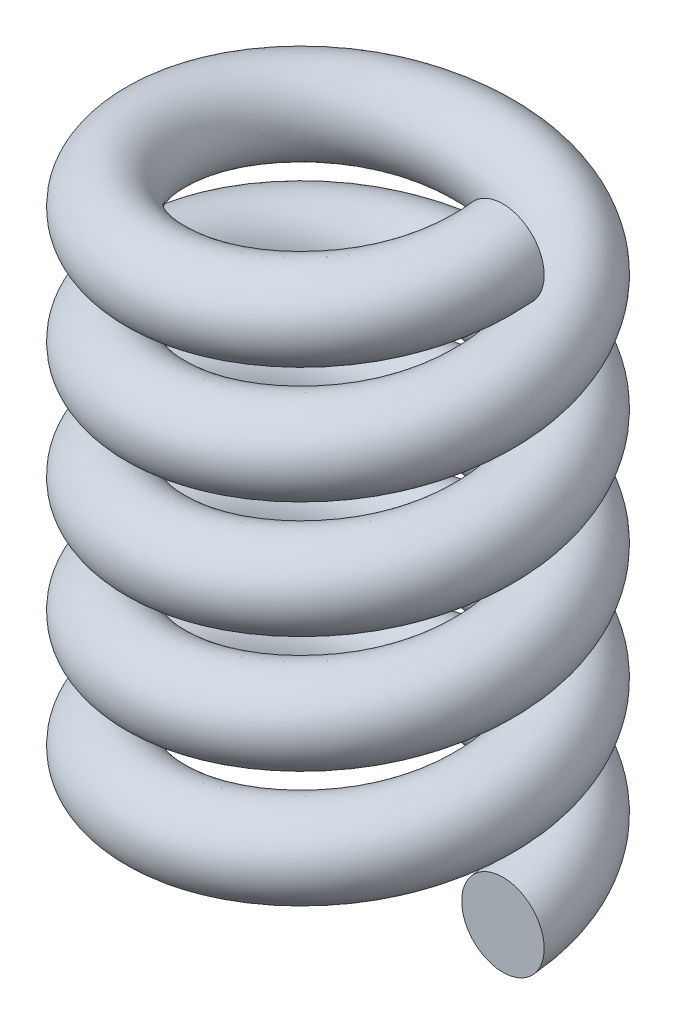
ISO-10303-21;
HEADER;
FILE_DESCRIPTION(('STEP AP214'),'2;1');
FILE_NAME('part.step','',(''),(''),'','','');
FILE_SCHEMA(('AUTOMOTIVE_DESIGN { 1 0 10303 214 1 1 1 1 }'));
ENDSEC;
DATA;
#1=APPLICATION_CONTEXT('core data for automotive mechanical design processes');
#2=APPLICATION_PROTOCOL_DEFINITION('international standard','automotive_design',2000,#1);
#3=PRODUCT_CONTEXT('',#1,'mechanical');
#4=PRODUCT('Part','Part','',(#3));
#5=PRODUCT_RELATED_PRODUCT_CATEGORY('part','',(#4));
#6=PRODUCT_DEFINITION_FORMATION('','',#4);
#7=PRODUCT_DEFINITION_CONTEXT('part definition',#1,'design');
#8=PRODUCT_DEFINITION('design','',#6,#7);
#9=PRODUCT_DEFINITION_SHAPE('','',#8);
#10=(LENGTH_UNIT() NAMED_UNIT(*) SI_UNIT(.MILLI.,.METRE.));
#11=(NAMED_UNIT(*) PLANE_ANGLE_UNIT() SI_UNIT($,.RADIAN.));
#12=(NAMED_UNIT(*) SI_UNIT($,.STERADIAN.) SOLID_ANGLE_UNIT());
#13=UNCERTAINTY_MEASURE_WITH_UNIT(LENGTH_MEASURE(1.E-05),#10,'distance_accuracy_value','');
#14=(GEOMETRIC_REPRESENTATION_CONTEXT(3) GLOBAL_UNCERTAINTY_ASSIGNED_CONTEXT((#13)) GLOBAL_UNIT_ASSIGNED_CONTEXT((#10,
#11,#12)) REPRESENTATION_CONTEXT('',''));
#15=CARTESIAN_POINT('',(0.,0.,0.));
#16=DIRECTION('',(0.,0.,1.));
#17=DIRECTION('',(1.,0.,0.));
#18=AXIS2_PLACEMENT_3D('',#15,#16,#17);
#19=CARTESIAN_POINT('',(20.,5.00122967202342,0.));
#20=DIRECTION('',(0.,0.,1.));
#21=DIRECTION('',(1.,0.,0.));
#22=AXIS2_PLACEMENT_3D('',#19,#20,#21);
#23=PLANE('',#22);
#24=CARTESIAN_POINT('',(20.,5.00122967202342,0.));
#25=DIRECTION('',(0.,0.,1.));
#26=DIRECTION('',(1.,0.,0.));
#27=AXIS2_PLACEMENT_3D('',#24,#25,#26);
#28=CIRCLE('',#27,5.);
#29=CARTESIAN_POINT('',(25.,5.00122967202342,0.));
#30=VERTEX_POINT('',#29);
#31=EDGE_CURVE('E39',#30,#30,#28,.T.);
#32=ORIENTED_EDGE('',*,*,#31,.T.);
#33=EDGE_LOOP('',(#32));
#34=FACE_BOUND('',#33,.T.);
#35=ADVANCED_FACE('F33',(#34),#23,.T.);
#36=CARTESIAN_POINT('',(20.,75.7185901385319,-1.39659253553725E-12));
#37=DIRECTION('',(0.,0.,1.));
#38=DIRECTION('',(1.,0.,0.));
#39=AXIS2_PLACEMENT_3D('',#36,#37,#38);
#40=PLANE('',#39);
#41=CARTESIAN_POINT('',(20.,75.7185901385319,-1.39659253553725E-12));
#42=DIRECTION('',(0.,0.,1.));
#43=DIRECTION('',(1.,0.,0.));
#44=AXIS2_PLACEMENT_3D('',#41,#42,#43);
#45=CIRCLE('',#44,5.);
#46=CARTESIAN_POINT('',(25.,75.7185901385319,-1.74574066942157E-12));
#47=VERTEX_POINT('',#46);
#48=EDGE_CURVE('E10',#47,#47,#45,.T.);
#49=ORIENTED_EDGE('',*,*,#48,.F.);
#50=EDGE_LOOP('',(#49));
#51=FACE_BOUND('',#50,.T.);
#52=ADVANCED_FACE('F48',(#51),#40,.F.);
#53=CARTESIAN_POINT('',(25.,5.00122967202342,0.));
#54=CARTESIAN_POINT('',(25.,5.88519667785478,-10.3553390593274));
#55=CARTESIAN_POINT('',(17.6776695296637,6.76916368368613,-17.6776695296637));
#56=CARTESIAN_POINT('',(10.3553390593274,7.65313068951748,-25.));
#57=CARTESIAN_POINT('',(0.,8.53709769534884,-25.));
#58=CARTESIAN_POINT('',(-10.3553390593274,9.42106470118019,-25.));
#59=CARTESIAN_POINT('',(-17.6776695296637,10.3050317070115,-17.6776695296637));
#60=CARTESIAN_POINT('',(-25.,11.1889987128429,-10.3553390593274));
#61=CARTESIAN_POINT('',(-25.,12.0729657186743,0.));
#62=CARTESIAN_POINT('',(-25.,12.9569327245056,10.3553390593274));
#63=CARTESIAN_POINT('',(-17.6776695296637,13.840899730337,17.6776695296637));
#64=CARTESIAN_POINT('',(-10.3553390593274,14.7248667361683,25.));
#65=CARTESIAN_POINT('',(0.,15.6088337419997,25.));
#66=CARTESIAN_POINT('',(10.3553390593274,16.492800747831,25.));
#67=CARTESIAN_POINT('',(17.6776695296637,17.3767677536624,17.6776695296637));
#68=CARTESIAN_POINT('',(25.,18.2607347594937,10.3553390593274));
#69=CARTESIAN_POINT('',(25.,19.1447017653251,0.));
#70=CARTESIAN_POINT('',(25.,20.0286687711564,-10.3553390593274));
#71=CARTESIAN_POINT('',(17.6776695296637,20.9126357769878,-17.6776695296637));
#72=CARTESIAN_POINT('',(10.3553390593274,21.7966027828191,-25.));
#73=CARTESIAN_POINT('',(0.,22.6805697886505,-25.));
#74=CARTESIAN_POINT('',(-10.3553390593274,23.5645367944818,-25.));
#75=CARTESIAN_POINT('',(-17.6776695296637,24.4485038003132,-17.6776695296637));
#76=CARTESIAN_POINT('',(-25.,25.3324708061446,-10.3553390593274));
#77=CARTESIAN_POINT('',(-25.,26.2164378119759,0.));
#78=CARTESIAN_POINT('',(-25.,27.1004048178073,10.3553390593274));
#79=CARTESIAN_POINT('',(-17.6776695296637,27.9843718236386,17.6776695296637));
#80=CARTESIAN_POINT('',(-10.3553390593274,28.86833882947,25.));
#81=CARTESIAN_POINT('',(0.,29.7523058353013,25.));
#82=CARTESIAN_POINT('',(10.3553390593274,30.6362728411327,25.));
#83=CARTESIAN_POINT('',(17.6776695296637,31.520239846964,17.6776695296637));
#84=CARTESIAN_POINT('',(25.,32.4042068527954,10.3553390593274));
#85=CARTESIAN_POINT('',(25.,33.2881738586267,0.));
#86=CARTESIAN_POINT('',(25.,34.1721408644581,-10.3553390593274));
#87=CARTESIAN_POINT('',(17.6776695296637,35.0561078702894,-17.6776695296637));
#88=CARTESIAN_POINT('',(10.3553390593274,35.9400748761208,-25.));
#89=CARTESIAN_POINT('',(0.,36.8240418819521,-25.));
#90=CARTESIAN_POINT('',(-10.3553390593274,37.7080088877835,-25.));
#91=CARTESIAN_POINT('',(-17.6776695296637,38.5919758936149,-17.6776695296637));
#92=CARTESIAN_POINT('',(-25.,39.4759428994462,-10.3553390593274));
#93=CARTESIAN_POINT('',(-25.,40.3599099052776,0.));
#94=CARTESIAN_POINT('',(-25.,41.2438769111089,10.3553390593274));
#95=CARTESIAN_POINT('',(-17.6776695296637,42.1278439169403,17.6776695296637));
#96=CARTESIAN_POINT('',(-10.3553390593274,43.0118109227716,25.));
#97=CARTESIAN_POINT('',(0.,43.895777928603,25.));
#98=CARTESIAN_POINT('',(10.3553390593274,44.7797449344343,25.));
#99=CARTESIAN_POINT('',(17.6776695296637,45.6637119402657,17.6776695296637));
#100=CARTESIAN_POINT('',(25.,46.547678946097,10.3553390593274));
#101=CARTESIAN_POINT('',(25.,47.4316459519284,0.));
#102=CARTESIAN_POINT('',(25.,48.3156129577597,-10.3553390593274));
#103=CARTESIAN_POINT('',(17.6776695296637,49.1995799635911,-17.6776695296637));
#104=CARTESIAN_POINT('',(10.3553390593274,50.0835469694224,-25.));
#105=CARTESIAN_POINT('',(0.,50.9675139752538,-25.));
#106=CARTESIAN_POINT('',(-10.3553390593274,51.8514809810852,-25.));
#107=CARTESIAN_POINT('',(-17.6776695296637,52.7354479869165,-17.6776695296637));
#108=CARTESIAN_POINT('',(-25.,53.6194149927479,-10.3553390593274));
#109=CARTESIAN_POINT('',(-25.,54.5033819985792,0.));
#110=CARTESIAN_POINT('',(-25.,55.3873490044106,10.3553390593274));
#111=CARTESIAN_POINT('',(-17.6776695296637,56.2713160102419,17.6776695296637));
#112=CARTESIAN_POINT('',(-10.3553390593274,57.1552830160733,25.));
#113=CARTESIAN_POINT('',(0.,58.0392500219046,25.));
#114=CARTESIAN_POINT('',(10.3553390593274,58.923217027736,25.));
#115=CARTESIAN_POINT('',(17.6776695296637,59.8071840335673,17.6776695296637));
#116=CARTESIAN_POINT('',(25.,60.6911510393987,10.3553390593274));
#117=CARTESIAN_POINT('',(25.,61.57511804523,0.));
#118=CARTESIAN_POINT('',(25.,62.4590850510614,-10.3553390593274));
#119=CARTESIAN_POINT('',(17.6776695296637,63.3430520568928,-17.6776695296637));
#120=CARTESIAN_POINT('',(10.3553390593274,64.2270190627241,-25.));
#121=CARTESIAN_POINT('',(0.,65.1109860685555,-25.));
#122=CARTESIAN_POINT('',(-10.3553390593274,65.9949530743868,-25.));
#123=CARTESIAN_POINT('',(-17.6776695296637,66.8789200802182,-17.6776695296637));
#124=CARTESIAN_POINT('',(-25.,67.7628870860495,-10.3553390593274));
#125=CARTESIAN_POINT('',(-25.,68.6468540918809,0.));
#126=CARTESIAN_POINT('',(-25.,69.5308210977122,10.3553390593274));
#127=CARTESIAN_POINT('',(-17.6776695296637,70.4147881035436,17.6776695296637));
#128=CARTESIAN_POINT('',(-10.3553390593274,71.2987551093749,25.));
#129=CARTESIAN_POINT('',(0.,72.1827221152063,25.));
#130=CARTESIAN_POINT('',(10.3553390593274,73.0666891210376,25.));
#131=CARTESIAN_POINT('',(17.6776695296637,73.950656126869,17.6776695296637));
#132=CARTESIAN_POINT('',(25.,74.8346231327004,10.3553390593274));
#133=CARTESIAN_POINT('',(25.,75.7185901385317,0.));
#134=CARTESIAN_POINT('',(25.,15.0012296720234,0.));
#135=CARTESIAN_POINT('',(25.,15.8851966778548,-10.3553390593274));
#136=CARTESIAN_POINT('',(17.6776695296637,16.7691636836861,-17.6776695296637));
#137=CARTESIAN_POINT('',(10.3553390593274,17.6531306895175,-25.));
#138=CARTESIAN_POINT('',(0.,18.5370976953488,-25.));
#139=CARTESIAN_POINT('',(-10.3553390593274,19.4210647011802,-25.));
#140=CARTESIAN_POINT('',(-17.6776695296637,20.3050317070115,-17.6776695296637));
#141=CARTESIAN_POINT('',(-25.,21.1889987128429,-10.3553390593274));
#142=CARTESIAN_POINT('',(-25.,22.0729657186742,0.));
#143=CARTESIAN_POINT('',(-25.,22.9569327245056,10.3553390593274));
#144=CARTESIAN_POINT('',(-17.6776695296637,23.840899730337,17.6776695296637));
#145=CARTESIAN_POINT('',(-10.3553390593274,24.7248667361683,25.));
#146=CARTESIAN_POINT('',(0.,25.6088337419997,25.));
#147=CARTESIAN_POINT('',(10.3553390593274,26.492800747831,25.));
#148=CARTESIAN_POINT('',(17.6776695296637,27.3767677536624,17.6776695296637));
#149=CARTESIAN_POINT('',(25.,28.2607347594937,10.3553390593274));
#150=CARTESIAN_POINT('',(25.,29.1447017653251,0.));
#151=CARTESIAN_POINT('',(25.,30.0286687711564,-10.3553390593274));
#152=CARTESIAN_POINT('',(17.6776695296637,30.9126357769878,-17.6776695296637));
#153=CARTESIAN_POINT('',(10.3553390593274,31.7966027828191,-25.));
#154=CARTESIAN_POINT('',(0.,32.6805697886505,-25.));
#155=CARTESIAN_POINT('',(-10.3553390593274,33.5645367944818,-25.));
#156=CARTESIAN_POINT('',(-17.6776695296637,34.4485038003132,-17.6776695296637));
#157=CARTESIAN_POINT('',(-25.,35.3324708061445,-10.3553390593274));
#158=CARTESIAN_POINT('',(-25.,36.2164378119759,0.));
#159=CARTESIAN_POINT('',(-25.,37.1004048178073,10.3553390593274));
#160=CARTESIAN_POINT('',(-17.6776695296637,37.9843718236386,17.6776695296637));
#161=CARTESIAN_POINT('',(-10.3553390593274,38.86833882947,25.));
#162=CARTESIAN_POINT('',(0.,39.7523058353013,25.));
#163=CARTESIAN_POINT('',(10.3553390593274,40.6362728411327,25.));
#164=CARTESIAN_POINT('',(17.6776695296637,41.520239846964,17.6776695296637));
#165=CARTESIAN_POINT('',(25.,42.4042068527954,10.3553390593274));
#166=CARTESIAN_POINT('',(25.,43.2881738586267,0.));
#167=CARTESIAN_POINT('',(25.,44.1721408644581,-10.3553390593274));
#168=CARTESIAN_POINT('',(17.6776695296637,45.0561078702894,-17.6776695296637));
#169=CARTESIAN_POINT('',(10.3553390593274,45.9400748761208,-25.));
#170=CARTESIAN_POINT('',(0.,46.8240418819521,-25.));
#171=CARTESIAN_POINT('',(-10.3553390593274,47.7080088877835,-25.));
#172=CARTESIAN_POINT('',(-17.6776695296637,48.5919758936149,-17.6776695296637));
#173=CARTESIAN_POINT('',(-25.,49.4759428994462,-10.3553390593274));
#174=CARTESIAN_POINT('',(-25.,50.3599099052776,0.));
#175=CARTESIAN_POINT('',(-25.,51.2438769111089,10.3553390593274));
#176=CARTESIAN_POINT('',(-17.6776695296637,52.1278439169403,17.6776695296637));
#177=CARTESIAN_POINT('',(-10.3553390593274,53.0118109227716,25.));
#178=CARTESIAN_POINT('',(0.,53.895777928603,25.));
#179=CARTESIAN_POINT('',(10.3553390593274,54.7797449344343,25.));
#180=CARTESIAN_POINT('',(17.6776695296637,55.6637119402657,17.6776695296637));
#181=CARTESIAN_POINT('',(25.,56.547678946097,10.3553390593274));
#182=CARTESIAN_POINT('',(25.,57.4316459519284,0.));
#183=CARTESIAN_POINT('',(25.,58.3156129577597,-10.3553390593274));
#184=CARTESIAN_POINT('',(17.6776695296637,59.1995799635911,-17.6776695296637));
#185=CARTESIAN_POINT('',(10.3553390593274,60.0835469694224,-25.));
#186=CARTESIAN_POINT('',(0.,60.9675139752538,-25.));
#187=CARTESIAN_POINT('',(-10.3553390593274,61.8514809810852,-25.));
#188=CARTESIAN_POINT('',(-17.6776695296637,62.7354479869165,-17.6776695296637));
#189=CARTESIAN_POINT('',(-25.,63.6194149927479,-10.3553390593274));
#190=CARTESIAN_POINT('',(-25.,64.5033819985792,0.));
#191=CARTESIAN_POINT('',(-25.,65.3873490044106,10.3553390593274));
#192=CARTESIAN_POINT('',(-17.6776695296637,66.2713160102419,17.6776695296637));
#193=CARTESIAN_POINT('',(-10.3553390593274,67.1552830160733,25.));
#194=CARTESIAN_POINT('',(0.,68.0392500219046,25.));
#195=CARTESIAN_POINT('',(10.3553390593274,68.923217027736,25.));
#196=CARTESIAN_POINT('',(17.6776695296637,69.8071840335673,17.6776695296637));
#197=CARTESIAN_POINT('',(25.,70.6911510393987,10.3553390593274));
#198=CARTESIAN_POINT('',(25.,71.57511804523,0.));
#199=CARTESIAN_POINT('',(25.,72.4590850510614,-10.3553390593274));
#200=CARTESIAN_POINT('',(17.6776695296637,73.3430520568927,-17.6776695296637));
#201=CARTESIAN_POINT('',(10.3553390593274,74.2270190627241,-25.));
#202=CARTESIAN_POINT('',(0.,75.1109860685555,-25.));
#203=CARTESIAN_POINT('',(-10.3553390593274,75.9949530743868,-25.));
#204=CARTESIAN_POINT('',(-17.6776695296637,76.8789200802182,-17.6776695296637));
#205=CARTESIAN_POINT('',(-25.,77.7628870860495,-10.3553390593274));
#206=CARTESIAN_POINT('',(-25.,78.6468540918809,0.));
#207=CARTESIAN_POINT('',(-25.,79.5308210977122,10.3553390593274));
#208=CARTESIAN_POINT('',(-17.6776695296637,80.4147881035436,17.6776695296637));
#209=CARTESIAN_POINT('',(-10.3553390593274,81.2987551093749,25.));
#210=CARTESIAN_POINT('',(0.,82.1827221152063,25.));
#211=CARTESIAN_POINT('',(10.3553390593274,83.0666891210376,25.));
#212=CARTESIAN_POINT('',(17.6776695296637,83.950656126869,17.6776695296637));
#213=CARTESIAN_POINT('',(25.,84.8346231327004,10.3553390593274));
#214=CARTESIAN_POINT('',(25.,85.7185901385317,0.));
#215=CARTESIAN_POINT('',(15.,15.0012296720234,0.));
#216=CARTESIAN_POINT('',(15.,15.8851966778548,-6.21320343559643));
#217=CARTESIAN_POINT('',(10.6066017177982,16.7691636836861,-10.6066017177982));
#218=CARTESIAN_POINT('',(6.21320343559643,17.6531306895175,-15.));
#219=CARTESIAN_POINT('',(0.,18.5370976953488,-15.));
#220=CARTESIAN_POINT('',(-6.21320343559643,19.4210647011802,-15.));
#221=CARTESIAN_POINT('',(-10.6066017177982,20.3050317070115,-10.6066017177982));
#222=CARTESIAN_POINT('',(-15.,21.1889987128429,-6.21320343559643));
#223=CARTESIAN_POINT('',(-15.,22.0729657186742,0.));
#224=CARTESIAN_POINT('',(-15.,22.9569327245056,6.21320343559643));
#225=CARTESIAN_POINT('',(-10.6066017177982,23.840899730337,10.6066017177982));
#226=CARTESIAN_POINT('',(-6.21320343559644,24.7248667361683,15.));
#227=CARTESIAN_POINT('',(0.,25.6088337419997,15.));
#228=CARTESIAN_POINT('',(6.21320343559643,26.492800747831,15.));
#229=CARTESIAN_POINT('',(10.6066017177982,27.3767677536624,10.6066017177982));
#230=CARTESIAN_POINT('',(15.,28.2607347594937,6.21320343559644));
#231=CARTESIAN_POINT('',(15.,29.1447017653251,0.));
#232=CARTESIAN_POINT('',(15.,30.0286687711564,-6.21320343559643));
#233=CARTESIAN_POINT('',(10.6066017177982,30.9126357769878,-10.6066017177982));
#234=CARTESIAN_POINT('',(6.21320343559643,31.7966027828191,-15.));
#235=CARTESIAN_POINT('',(0.,32.6805697886505,-15.));
#236=CARTESIAN_POINT('',(-6.21320343559643,33.5645367944818,-15.));
#237=CARTESIAN_POINT('',(-10.6066017177982,34.4485038003132,-10.6066017177982));
#238=CARTESIAN_POINT('',(-15.,35.3324708061445,-6.21320343559643));
#239=CARTESIAN_POINT('',(-15.,36.2164378119759,0.));
#240=CARTESIAN_POINT('',(-15.,37.1004048178073,6.21320343559643));
#241=CARTESIAN_POINT('',(-10.6066017177982,37.9843718236386,10.6066017177982));
#242=CARTESIAN_POINT('',(-6.21320343559644,38.86833882947,15.));
#243=CARTESIAN_POINT('',(0.,39.7523058353013,15.));
#244=CARTESIAN_POINT('',(6.21320343559643,40.6362728411327,15.));
#245=CARTESIAN_POINT('',(10.6066017177982,41.520239846964,10.6066017177982));
#246=CARTESIAN_POINT('',(15.,42.4042068527954,6.21320343559644));
#247=CARTESIAN_POINT('',(15.,43.2881738586267,0.));
#248=CARTESIAN_POINT('',(15.,44.1721408644581,-6.21320343559643));
#249=CARTESIAN_POINT('',(10.6066017177982,45.0561078702894,-10.6066017177982));
#250=CARTESIAN_POINT('',(6.21320343559643,45.9400748761208,-15.));
#251=CARTESIAN_POINT('',(0.,46.8240418819521,-15.));
#252=CARTESIAN_POINT('',(-6.21320343559643,47.7080088877835,-15.));
#253=CARTESIAN_POINT('',(-10.6066017177982,48.5919758936149,-10.6066017177982));
#254=CARTESIAN_POINT('',(-15.,49.4759428994462,-6.21320343559643));
#255=CARTESIAN_POINT('',(-15.,50.3599099052776,0.));
#256=CARTESIAN_POINT('',(-15.,51.2438769111089,6.21320343559643));
#257=CARTESIAN_POINT('',(-10.6066017177982,52.1278439169403,10.6066017177982));
#258=CARTESIAN_POINT('',(-6.21320343559644,53.0118109227716,15.));
#259=CARTESIAN_POINT('',(0.,53.895777928603,15.));
#260=CARTESIAN_POINT('',(6.21320343559643,54.7797449344343,15.));
#261=CARTESIAN_POINT('',(10.6066017177982,55.6637119402657,10.6066017177982));
#262=CARTESIAN_POINT('',(15.,56.547678946097,6.21320343559644));
#263=CARTESIAN_POINT('',(15.,57.4316459519284,0.));
#264=CARTESIAN_POINT('',(15.,58.3156129577597,-6.21320343559643));
#265=CARTESIAN_POINT('',(10.6066017177982,59.1995799635911,-10.6066017177982));
#266=CARTESIAN_POINT('',(6.21320343559643,60.0835469694224,-15.));
#267=CARTESIAN_POINT('',(0.,60.9675139752538,-15.));
#268=CARTESIAN_POINT('',(-6.21320343559643,61.8514809810852,-15.));
#269=CARTESIAN_POINT('',(-10.6066017177982,62.7354479869165,-10.6066017177982));
#270=CARTESIAN_POINT('',(-15.,63.6194149927479,-6.21320343559643));
#271=CARTESIAN_POINT('',(-15.,64.5033819985792,0.));
#272=CARTESIAN_POINT('',(-15.,65.3873490044106,6.21320343559643));
#273=CARTESIAN_POINT('',(-10.6066017177982,66.2713160102419,10.6066017177982));
#274=CARTESIAN_POINT('',(-6.21320343559644,67.1552830160733,15.));
#275=CARTESIAN_POINT('',(0.,68.0392500219046,15.));
#276=CARTESIAN_POINT('',(6.21320343559643,68.923217027736,15.));
#277=CARTESIAN_POINT('',(10.6066017177982,69.8071840335673,10.6066017177982));
#278=CARTESIAN_POINT('',(15.,70.6911510393987,6.21320343559644));
#279=CARTESIAN_POINT('',(15.,71.5751180452301,0.));
#280=CARTESIAN_POINT('',(15.,72.4590850510614,-6.21320343559643));
#281=CARTESIAN_POINT('',(10.6066017177982,73.3430520568927,-10.6066017177982));
#282=CARTESIAN_POINT('',(6.21320343559643,74.2270190627241,-15.));
#283=CARTESIAN_POINT('',(0.,75.1109860685555,-15.));
#284=CARTESIAN_POINT('',(-6.21320343559643,75.9949530743868,-15.));
#285=CARTESIAN_POINT('',(-10.6066017177982,76.8789200802182,-10.6066017177982));
#286=CARTESIAN_POINT('',(-15.,77.7628870860495,-6.21320343559643));
#287=CARTESIAN_POINT('',(-15.,78.6468540918809,0.));
#288=CARTESIAN_POINT('',(-15.,79.5308210977122,6.21320343559643));
#289=CARTESIAN_POINT('',(-10.6066017177982,80.4147881035436,10.6066017177982));
#290=CARTESIAN_POINT('',(-6.21320343559644,81.2987551093749,15.));
#291=CARTESIAN_POINT('',(0.,82.1827221152063,15.));
#292=CARTESIAN_POINT('',(6.21320343559643,83.0666891210376,15.));
#293=CARTESIAN_POINT('',(10.6066017177982,83.950656126869,10.6066017177982));
#294=CARTESIAN_POINT('',(15.,84.8346231327004,6.21320343559644));
#295=CARTESIAN_POINT('',(15.,85.7185901385317,0.));
#296=CARTESIAN_POINT('',(15.,5.00122967202342,0.));
#297=CARTESIAN_POINT('',(15.,5.88519667785478,-6.21320343559643));
#298=CARTESIAN_POINT('',(10.6066017177982,6.76916368368613,-10.6066017177982));
#299=CARTESIAN_POINT('',(6.21320343559643,7.65313068951748,-15.));
#300=CARTESIAN_POINT('',(0.,8.53709769534884,-15.));
#301=CARTESIAN_POINT('',(-6.21320343559643,9.42106470118019,-15.));
#302=CARTESIAN_POINT('',(-10.6066017177982,10.3050317070115,-10.6066017177982));
#303=CARTESIAN_POINT('',(-15.,11.1889987128429,-6.21320343559643));
#304=CARTESIAN_POINT('',(-15.,12.0729657186743,0.));
#305=CARTESIAN_POINT('',(-15.,12.9569327245056,6.21320343559642));
#306=CARTESIAN_POINT('',(-10.6066017177982,13.840899730337,10.6066017177982));
#307=CARTESIAN_POINT('',(-6.21320343559644,14.7248667361683,15.));
#308=CARTESIAN_POINT('',(0.,15.6088337419997,15.));
#309=CARTESIAN_POINT('',(6.21320343559643,16.492800747831,15.));
#310=CARTESIAN_POINT('',(10.6066017177982,17.3767677536624,10.6066017177982));
#311=CARTESIAN_POINT('',(15.,18.2607347594937,6.21320343559644));
#312=CARTESIAN_POINT('',(15.,19.1447017653251,0.));
#313=CARTESIAN_POINT('',(15.,20.0286687711564,-6.21320343559643));
#314=CARTESIAN_POINT('',(10.6066017177982,20.9126357769878,-10.6066017177982));
#315=CARTESIAN_POINT('',(6.21320343559643,21.7966027828191,-15.));
#316=CARTESIAN_POINT('',(0.,22.6805697886505,-15.));
#317=CARTESIAN_POINT('',(-6.21320343559643,23.5645367944818,-15.));
#318=CARTESIAN_POINT('',(-10.6066017177982,24.4485038003132,-10.6066017177982));
#319=CARTESIAN_POINT('',(-15.,25.3324708061446,-6.21320343559643));
#320=CARTESIAN_POINT('',(-15.,26.2164378119759,0.));
#321=CARTESIAN_POINT('',(-15.,27.1004048178073,6.21320343559642));
#322=CARTESIAN_POINT('',(-10.6066017177982,27.9843718236386,10.6066017177982));
#323=CARTESIAN_POINT('',(-6.21320343559644,28.86833882947,15.));
#324=CARTESIAN_POINT('',(0.,29.7523058353013,15.));
#325=CARTESIAN_POINT('',(6.21320343559643,30.6362728411327,15.));
#326=CARTESIAN_POINT('',(10.6066017177982,31.520239846964,10.6066017177982));
#327=CARTESIAN_POINT('',(15.,32.4042068527954,6.21320343559644));
#328=CARTESIAN_POINT('',(15.,33.2881738586267,0.));
#329=CARTESIAN_POINT('',(15.,34.1721408644581,-6.21320343559643));
#330=CARTESIAN_POINT('',(10.6066017177982,35.0561078702894,-10.6066017177982));
#331=CARTESIAN_POINT('',(6.21320343559643,35.9400748761208,-15.));
#332=CARTESIAN_POINT('',(0.,36.8240418819522,-15.));
#333=CARTESIAN_POINT('',(-6.21320343559643,37.7080088877835,-15.));
#334=CARTESIAN_POINT('',(-10.6066017177982,38.5919758936149,-10.6066017177982));
#335=CARTESIAN_POINT('',(-15.,39.4759428994462,-6.21320343559643));
#336=CARTESIAN_POINT('',(-15.,40.3599099052776,0.));
#337=CARTESIAN_POINT('',(-15.,41.2438769111089,6.21320343559642));
#338=CARTESIAN_POINT('',(-10.6066017177982,42.1278439169403,10.6066017177982));
#339=CARTESIAN_POINT('',(-6.21320343559644,43.0118109227716,15.));
#340=CARTESIAN_POINT('',(0.,43.895777928603,15.));
#341=CARTESIAN_POINT('',(6.21320343559643,44.7797449344343,15.));
#342=CARTESIAN_POINT('',(10.6066017177982,45.6637119402657,10.6066017177982));
#343=CARTESIAN_POINT('',(15.,46.547678946097,6.21320343559644));
#344=CARTESIAN_POINT('',(15.,47.4316459519284,0.));
#345=CARTESIAN_POINT('',(15.,48.3156129577597,-6.21320343559643));
#346=CARTESIAN_POINT('',(10.6066017177982,49.1995799635911,-10.6066017177982));
#347=CARTESIAN_POINT('',(6.21320343559643,50.0835469694224,-15.));
#348=CARTESIAN_POINT('',(0.,50.9675139752538,-15.));
#349=CARTESIAN_POINT('',(-6.21320343559643,51.8514809810852,-15.));
#350=CARTESIAN_POINT('',(-10.6066017177982,52.7354479869165,-10.6066017177982));
#351=CARTESIAN_POINT('',(-15.,53.6194149927479,-6.21320343559643));
#352=CARTESIAN_POINT('',(-15.,54.5033819985792,0.));
#353=CARTESIAN_POINT('',(-15.,55.3873490044106,6.21320343559642));
#354=CARTESIAN_POINT('',(-10.6066017177982,56.2713160102419,10.6066017177982));
#355=CARTESIAN_POINT('',(-6.21320343559644,57.1552830160733,15.));
#356=CARTESIAN_POINT('',(0.,58.0392500219046,15.));
#357=CARTESIAN_POINT('',(6.21320343559643,58.923217027736,15.));
#358=CARTESIAN_POINT('',(10.6066017177982,59.8071840335673,10.6066017177982));
#359=CARTESIAN_POINT('',(15.,60.6911510393987,6.21320343559644));
#360=CARTESIAN_POINT('',(15.,61.5751180452301,0.));
#361=CARTESIAN_POINT('',(15.,62.4590850510614,-6.21320343559643));
#362=CARTESIAN_POINT('',(10.6066017177982,63.3430520568928,-10.6066017177982));
#363=CARTESIAN_POINT('',(6.21320343559643,64.2270190627241,-15.));
#364=CARTESIAN_POINT('',(0.,65.1109860685555,-15.));
#365=CARTESIAN_POINT('',(-6.21320343559643,65.9949530743868,-15.));
#366=CARTESIAN_POINT('',(-10.6066017177982,66.8789200802182,-10.6066017177982));
#367=CARTESIAN_POINT('',(-15.,67.7628870860495,-6.21320343559643));
#368=CARTESIAN_POINT('',(-15.,68.6468540918809,0.));
#369=CARTESIAN_POINT('',(-15.,69.5308210977122,6.21320343559642));
#370=CARTESIAN_POINT('',(-10.6066017177982,70.4147881035436,10.6066017177982));
#371=CARTESIAN_POINT('',(-6.21320343559644,71.2987551093749,15.));
#372=CARTESIAN_POINT('',(0.,72.1827221152063,15.));
#373=CARTESIAN_POINT('',(6.21320343559643,73.0666891210376,15.));
#374=CARTESIAN_POINT('',(10.6066017177982,73.950656126869,10.6066017177982));
#375=CARTESIAN_POINT('',(15.,74.8346231327004,6.21320343559644));
#376=CARTESIAN_POINT('',(15.,75.7185901385317,0.));
#377=CARTESIAN_POINT('',(15.,-4.99877032797657,0.));
#378=CARTESIAN_POINT('',(15.,-4.11480332214522,-6.21320343559643));
#379=CARTESIAN_POINT('',(10.6066017177982,-3.23083631631386,-10.6066017177982));
#380=CARTESIAN_POINT('',(6.21320343559643,-2.34686931048251,-15.));
#381=CARTESIAN_POINT('',(0.,-1.46290230465116,-15.));
#382=CARTESIAN_POINT('',(-6.21320343559643,-0.578935298819803,-15.));
#383=CARTESIAN_POINT('',(-10.6066017177982,0.305031707011551,-10.6066017177982));
#384=CARTESIAN_POINT('',(-15.,1.1889987128429,-6.21320343559643));
#385=CARTESIAN_POINT('',(-15.,2.07296571867426,0.));
#386=CARTESIAN_POINT('',(-15.,2.95693272450561,6.21320343559642));
#387=CARTESIAN_POINT('',(-10.6066017177982,3.84089973033696,10.6066017177982));
#388=CARTESIAN_POINT('',(-6.21320343559644,4.72486673616832,15.));
#389=CARTESIAN_POINT('',(0.,5.60883374199967,15.));
#390=CARTESIAN_POINT('',(6.21320343559643,6.49280074783103,15.));
#391=CARTESIAN_POINT('',(10.6066017177982,7.37676775366238,10.6066017177982));
#392=CARTESIAN_POINT('',(15.,8.26073475949373,6.21320343559644));
#393=CARTESIAN_POINT('',(15.,9.14470176532509,0.));
#394=CARTESIAN_POINT('',(15.,10.0286687711564,-6.21320343559643));
#395=CARTESIAN_POINT('',(10.6066017177982,10.9126357769878,-10.6066017177982));
#396=CARTESIAN_POINT('',(6.21320343559643,11.7966027828191,-15.));
#397=CARTESIAN_POINT('',(0.,12.6805697886505,-15.));
#398=CARTESIAN_POINT('',(-6.21320343559643,13.5645367944819,-15.));
#399=CARTESIAN_POINT('',(-10.6066017177982,14.4485038003132,-10.6066017177982));
#400=CARTESIAN_POINT('',(-15.,15.3324708061446,-6.21320343559643));
#401=CARTESIAN_POINT('',(-15.,16.2164378119759,0.));
#402=CARTESIAN_POINT('',(-15.,17.1004048178073,6.21320343559642));
#403=CARTESIAN_POINT('',(-10.6066017177982,17.9843718236386,10.6066017177982));
#404=CARTESIAN_POINT('',(-6.21320343559644,18.86833882947,15.));
#405=CARTESIAN_POINT('',(0.,19.7523058353013,15.));
#406=CARTESIAN_POINT('',(6.21320343559643,20.6362728411327,15.));
#407=CARTESIAN_POINT('',(10.6066017177982,21.520239846964,10.6066017177982));
#408=CARTESIAN_POINT('',(15.,22.4042068527954,6.21320343559644));
#409=CARTESIAN_POINT('',(15.,23.2881738586267,0.));
#410=CARTESIAN_POINT('',(15.,24.1721408644581,-6.21320343559643));
#411=CARTESIAN_POINT('',(10.6066017177982,25.0561078702895,-10.6066017177982));
#412=CARTESIAN_POINT('',(6.21320343559643,25.9400748761208,-15.));
#413=CARTESIAN_POINT('',(0.,26.8240418819522,-15.));
#414=CARTESIAN_POINT('',(-6.21320343559643,27.7080088877835,-15.));
#415=CARTESIAN_POINT('',(-10.6066017177982,28.5919758936149,-10.6066017177982));
#416=CARTESIAN_POINT('',(-15.,29.4759428994462,-6.21320343559643));
#417=CARTESIAN_POINT('',(-15.,30.3599099052776,0.));
#418=CARTESIAN_POINT('',(-15.,31.2438769111089,6.21320343559642));
#419=CARTESIAN_POINT('',(-10.6066017177982,32.1278439169403,10.6066017177982));
#420=CARTESIAN_POINT('',(-6.21320343559644,33.0118109227716,15.));
#421=CARTESIAN_POINT('',(0.,33.895777928603,15.));
#422=CARTESIAN_POINT('',(6.21320343559643,34.7797449344343,15.));
#423=CARTESIAN_POINT('',(10.6066017177982,35.6637119402657,10.6066017177982));
#424=CARTESIAN_POINT('',(15.,36.5476789460971,6.21320343559644));
#425=CARTESIAN_POINT('',(15.,37.4316459519284,0.));
#426=CARTESIAN_POINT('',(15.,38.3156129577598,-6.21320343559643));
#427=CARTESIAN_POINT('',(10.6066017177982,39.1995799635911,-10.6066017177982));
#428=CARTESIAN_POINT('',(6.21320343559643,40.0835469694225,-15.));
#429=CARTESIAN_POINT('',(0.,40.9675139752538,-15.));
#430=CARTESIAN_POINT('',(-6.21320343559643,41.8514809810852,-15.));
#431=CARTESIAN_POINT('',(-10.6066017177982,42.7354479869165,-10.6066017177982));
#432=CARTESIAN_POINT('',(-15.,43.6194149927479,-6.21320343559643));
#433=CARTESIAN_POINT('',(-15.,44.5033819985792,0.));
#434=CARTESIAN_POINT('',(-15.,45.3873490044106,6.21320343559642));
#435=CARTESIAN_POINT('',(-10.6066017177982,46.2713160102419,10.6066017177982));
#436=CARTESIAN_POINT('',(-6.21320343559644,47.1552830160733,15.));
#437=CARTESIAN_POINT('',(0.,48.0392500219046,15.));
#438=CARTESIAN_POINT('',(6.21320343559643,48.923217027736,15.));
#439=CARTESIAN_POINT('',(10.6066017177982,49.8071840335674,10.6066017177982));
#440=CARTESIAN_POINT('',(15.,50.6911510393987,6.21320343559644));
#441=CARTESIAN_POINT('',(15.,51.5751180452301,0.));
#442=CARTESIAN_POINT('',(15.,52.4590850510614,-6.21320343559643));
#443=CARTESIAN_POINT('',(10.6066017177982,53.3430520568928,-10.6066017177982));
#444=CARTESIAN_POINT('',(6.21320343559643,54.2270190627241,-15.));
#445=CARTESIAN_POINT('',(0.,55.1109860685555,-15.));
#446=CARTESIAN_POINT('',(-6.21320343559643,55.9949530743868,-15.));
#447=CARTESIAN_POINT('',(-10.6066017177982,56.8789200802182,-10.6066017177982));
#448=CARTESIAN_POINT('',(-15.,57.7628870860495,-6.21320343559643));
#449=CARTESIAN_POINT('',(-15.,58.6468540918809,0.));
#450=CARTESIAN_POINT('',(-15.,59.5308210977123,6.21320343559642));
#451=CARTESIAN_POINT('',(-10.6066017177982,60.4147881035436,10.6066017177982));
#452=CARTESIAN_POINT('',(-6.21320343559644,61.2987551093749,15.));
#453=CARTESIAN_POINT('',(0.,62.1827221152063,15.));
#454=CARTESIAN_POINT('',(6.21320343559643,63.0666891210377,15.));
#455=CARTESIAN_POINT('',(10.6066017177982,63.950656126869,10.6066017177982));
#456=CARTESIAN_POINT('',(15.,64.8346231327004,6.21320343559644));
#457=CARTESIAN_POINT('',(15.,65.7185901385317,0.));
#458=CARTESIAN_POINT('',(25.,-4.99877032797657,0.));
#459=CARTESIAN_POINT('',(25.,-4.11480332214522,-10.3553390593274));
#460=CARTESIAN_POINT('',(17.6776695296637,-3.23083631631386,-17.6776695296637));
#461=CARTESIAN_POINT('',(10.3553390593274,-2.34686931048251,-25.));
#462=CARTESIAN_POINT('',(0.,-1.46290230465116,-25.));
#463=CARTESIAN_POINT('',(-10.3553390593274,-0.578935298819804,-25.));
#464=CARTESIAN_POINT('',(-17.6776695296637,0.30503170701155,-17.6776695296637));
#465=CARTESIAN_POINT('',(-25.,1.1889987128429,-10.3553390593274));
#466=CARTESIAN_POINT('',(-25.,2.07296571867426,0.));
#467=CARTESIAN_POINT('',(-25.,2.95693272450561,10.3553390593274));
#468=CARTESIAN_POINT('',(-17.6776695296637,3.84089973033696,17.6776695296637));
#469=CARTESIAN_POINT('',(-10.3553390593274,4.72486673616832,25.));
#470=CARTESIAN_POINT('',(0.,5.60883374199967,25.));
#471=CARTESIAN_POINT('',(10.3553390593274,6.49280074783103,25.));
#472=CARTESIAN_POINT('',(17.6776695296637,7.37676775366238,17.6776695296637));
#473=CARTESIAN_POINT('',(25.,8.26073475949373,10.3553390593274));
#474=CARTESIAN_POINT('',(25.,9.14470176532509,0.));
#475=CARTESIAN_POINT('',(25.,10.0286687711564,-10.3553390593274));
#476=CARTESIAN_POINT('',(17.6776695296637,10.9126357769878,-17.6776695296637));
#477=CARTESIAN_POINT('',(10.3553390593274,11.7966027828191,-25.));
#478=CARTESIAN_POINT('',(0.,12.6805697886505,-25.));
#479=CARTESIAN_POINT('',(-10.3553390593274,13.5645367944819,-25.));
#480=CARTESIAN_POINT('',(-17.6776695296637,14.4485038003132,-17.6776695296637));
#481=CARTESIAN_POINT('',(-25.,15.3324708061446,-10.3553390593274));
#482=CARTESIAN_POINT('',(-25.,16.2164378119759,0.));
#483=CARTESIAN_POINT('',(-25.,17.1004048178073,10.3553390593274));
#484=CARTESIAN_POINT('',(-17.6776695296637,17.9843718236386,17.6776695296637));
#485=CARTESIAN_POINT('',(-10.3553390593274,18.86833882947,25.));
#486=CARTESIAN_POINT('',(0.,19.7523058353013,25.));
#487=CARTESIAN_POINT('',(10.3553390593274,20.6362728411327,25.));
#488=CARTESIAN_POINT('',(17.6776695296637,21.520239846964,17.6776695296637));
#489=CARTESIAN_POINT('',(25.,22.4042068527954,10.3553390593274));
#490=CARTESIAN_POINT('',(25.,23.2881738586267,0.));
#491=CARTESIAN_POINT('',(25.,24.1721408644581,-10.3553390593274));
#492=CARTESIAN_POINT('',(17.6776695296637,25.0561078702894,-17.6776695296637));
#493=CARTESIAN_POINT('',(10.3553390593274,25.9400748761208,-25.));
#494=CARTESIAN_POINT('',(0.,26.8240418819522,-25.));
#495=CARTESIAN_POINT('',(-10.3553390593274,27.7080088877835,-25.));
#496=CARTESIAN_POINT('',(-17.6776695296637,28.5919758936149,-17.6776695296637));
#497=CARTESIAN_POINT('',(-25.,29.4759428994462,-10.3553390593274));
#498=CARTESIAN_POINT('',(-25.,30.3599099052776,0.));
#499=CARTESIAN_POINT('',(-25.,31.2438769111089,10.3553390593274));
#500=CARTESIAN_POINT('',(-17.6776695296637,32.1278439169403,17.6776695296637));
#501=CARTESIAN_POINT('',(-10.3553390593274,33.0118109227716,25.));
#502=CARTESIAN_POINT('',(0.,33.895777928603,25.));
#503=CARTESIAN_POINT('',(10.3553390593274,34.7797449344343,25.));
#504=CARTESIAN_POINT('',(17.6776695296637,35.6637119402657,17.6776695296637));
#505=CARTESIAN_POINT('',(25.,36.5476789460971,10.3553390593274));
#506=CARTESIAN_POINT('',(25.,37.4316459519284,0.));
#507=CARTESIAN_POINT('',(25.,38.3156129577598,-10.3553390593274));
#508=CARTESIAN_POINT('',(17.6776695296637,39.1995799635911,-17.6776695296637));
#509=CARTESIAN_POINT('',(10.3553390593274,40.0835469694225,-25.));
#510=CARTESIAN_POINT('',(0.,40.9675139752538,-25.));
#511=CARTESIAN_POINT('',(-10.3553390593274,41.8514809810852,-25.));
#512=CARTESIAN_POINT('',(-17.6776695296637,42.7354479869165,-17.6776695296637));
#513=CARTESIAN_POINT('',(-25.,43.6194149927479,-10.3553390593274));
#514=CARTESIAN_POINT('',(-25.,44.5033819985792,0.));
#515=CARTESIAN_POINT('',(-25.,45.3873490044106,10.3553390593274));
#516=CARTESIAN_POINT('',(-17.6776695296637,46.2713160102419,17.6776695296637));
#517=CARTESIAN_POINT('',(-10.3553390593274,47.1552830160733,25.));
#518=CARTESIAN_POINT('',(0.,48.0392500219046,25.));
#519=CARTESIAN_POINT('',(10.3553390593274,48.923217027736,25.));
#520=CARTESIAN_POINT('',(17.6776695296637,49.8071840335674,17.6776695296637));
#521=CARTESIAN_POINT('',(25.,50.6911510393987,10.3553390593274));
#522=CARTESIAN_POINT('',(25.,51.5751180452301,0.));
#523=CARTESIAN_POINT('',(25.,52.4590850510614,-10.3553390593274));
#524=CARTESIAN_POINT('',(17.6776695296637,53.3430520568928,-17.6776695296637));
#525=CARTESIAN_POINT('',(10.3553390593274,54.2270190627241,-25.));
#526=CARTESIAN_POINT('',(0.,55.1109860685555,-25.));
#527=CARTESIAN_POINT('',(-10.3553390593274,55.9949530743868,-25.));
#528=CARTESIAN_POINT('',(-17.6776695296637,56.8789200802182,-17.6776695296637));
#529=CARTESIAN_POINT('',(-25.,57.7628870860495,-10.3553390593274));
#530=CARTESIAN_POINT('',(-25.,58.6468540918809,0.));
#531=CARTESIAN_POINT('',(-25.,59.5308210977123,10.3553390593274));
#532=CARTESIAN_POINT('',(-17.6776695296637,60.4147881035436,17.6776695296637));
#533=CARTESIAN_POINT('',(-10.3553390593274,61.2987551093749,25.));
#534=CARTESIAN_POINT('',(0.,62.1827221152063,25.));
#535=CARTESIAN_POINT('',(10.3553390593274,63.0666891210377,25.));
#536=CARTESIAN_POINT('',(17.6776695296637,63.950656126869,17.6776695296637));
#537=CARTESIAN_POINT('',(25.,64.8346231327004,10.3553390593274));
#538=CARTESIAN_POINT('',(25.,65.7185901385317,0.));
#539=CARTESIAN_POINT('',(25.,5.00122967202342,0.));
#540=CARTESIAN_POINT('',(25.,5.88519667785478,-10.3553390593274));
#541=CARTESIAN_POINT('',(17.6776695296637,6.76916368368613,-17.6776695296637));
#542=CARTESIAN_POINT('',(10.3553390593274,7.65313068951748,-25.));
#543=CARTESIAN_POINT('',(0.,8.53709769534884,-25.));
#544=CARTESIAN_POINT('',(-10.3553390593274,9.42106470118019,-25.));
#545=CARTESIAN_POINT('',(-17.6776695296637,10.3050317070115,-17.6776695296637));
#546=CARTESIAN_POINT('',(-25.,11.1889987128429,-10.3553390593274));
#547=CARTESIAN_POINT('',(-25.,12.0729657186743,0.));
#548=CARTESIAN_POINT('',(-25.,12.9569327245056,10.3553390593274));
#549=CARTESIAN_POINT('',(-17.6776695296637,13.840899730337,17.6776695296637));
#550=CARTESIAN_POINT('',(-10.3553390593274,14.7248667361683,25.));
#551=CARTESIAN_POINT('',(0.,15.6088337419997,25.));
#552=CARTESIAN_POINT('',(10.3553390593274,16.492800747831,25.));
#553=CARTESIAN_POINT('',(17.6776695296637,17.3767677536624,17.6776695296637));
#554=CARTESIAN_POINT('',(25.,18.2607347594937,10.3553390593274));
#555=CARTESIAN_POINT('',(25.,19.1447017653251,0.));
#556=CARTESIAN_POINT('',(25.,20.0286687711564,-10.3553390593274));
#557=CARTESIAN_POINT('',(17.6776695296637,20.9126357769878,-17.6776695296637));
#558=CARTESIAN_POINT('',(10.3553390593274,21.7966027828191,-25.));
#559=CARTESIAN_POINT('',(0.,22.6805697886505,-25.));
#560=CARTESIAN_POINT('',(-10.3553390593274,23.5645367944818,-25.));
#561=CARTESIAN_POINT('',(-17.6776695296637,24.4485038003132,-17.6776695296637));
#562=CARTESIAN_POINT('',(-25.,25.3324708061446,-10.3553390593274));
#563=CARTESIAN_POINT('',(-25.,26.2164378119759,0.));
#564=CARTESIAN_POINT('',(-25.,27.1004048178073,10.3553390593274));
#565=CARTESIAN_POINT('',(-17.6776695296637,27.9843718236386,17.6776695296637));
#566=CARTESIAN_POINT('',(-10.3553390593274,28.86833882947,25.));
#567=CARTESIAN_POINT('',(0.,29.7523058353013,25.));
#568=CARTESIAN_POINT('',(10.3553390593274,30.6362728411327,25.));
#569=CARTESIAN_POINT('',(17.6776695296637,31.520239846964,17.6776695296637));
#570=CARTESIAN_POINT('',(25.,32.4042068527954,10.3553390593274));
#571=CARTESIAN_POINT('',(25.,33.2881738586267,0.));
#572=CARTESIAN_POINT('',(25.,34.1721408644581,-10.3553390593274));
#573=CARTESIAN_POINT('',(17.6776695296637,35.0561078702894,-17.6776695296637));
#574=CARTESIAN_POINT('',(10.3553390593274,35.9400748761208,-25.));
#575=CARTESIAN_POINT('',(0.,36.8240418819521,-25.));
#576=CARTESIAN_POINT('',(-10.3553390593274,37.7080088877835,-25.));
#577=CARTESIAN_POINT('',(-17.6776695296637,38.5919758936149,-17.6776695296637));
#578=CARTESIAN_POINT('',(-25.,39.4759428994462,-10.3553390593274));
#579=CARTESIAN_POINT('',(-25.,40.3599099052776,0.));
#580=CARTESIAN_POINT('',(-25.,41.2438769111089,10.3553390593274));
#581=CARTESIAN_POINT('',(-17.6776695296637,42.1278439169403,17.6776695296637));
#582=CARTESIAN_POINT('',(-10.3553390593274,43.0118109227716,25.));
#583=CARTESIAN_POINT('',(0.,43.895777928603,25.));
#584=CARTESIAN_POINT('',(10.3553390593274,44.7797449344343,25.));
#585=CARTESIAN_POINT('',(17.6776695296637,45.6637119402657,17.6776695296637));
#586=CARTESIAN_POINT('',(25.,46.547678946097,10.3553390593274));
#587=CARTESIAN_POINT('',(25.,47.4316459519284,0.));
#588=CARTESIAN_POINT('',(25.,48.3156129577597,-10.3553390593274));
#589=CARTESIAN_POINT('',(17.6776695296637,49.1995799635911,-17.6776695296637));
#590=CARTESIAN_POINT('',(10.3553390593274,50.0835469694224,-25.));
#591=CARTESIAN_POINT('',(0.,50.9675139752538,-25.));
#592=CARTESIAN_POINT('',(-10.3553390593274,51.8514809810852,-25.));
#593=CARTESIAN_POINT('',(-17.6776695296637,52.7354479869165,-17.6776695296637));
#594=CARTESIAN_POINT('',(-25.,53.6194149927479,-10.3553390593274));
#595=CARTESIAN_POINT('',(-25.,54.5033819985792,0.));
#596=CARTESIAN_POINT('',(-25.,55.3873490044106,10.3553390593274));
#597=CARTESIAN_POINT('',(-17.6776695296637,56.2713160102419,17.6776695296637));
#598=CARTESIAN_POINT('',(-10.3553390593274,57.1552830160733,25.));
#599=CARTESIAN_POINT('',(0.,58.0392500219046,25.));
#600=CARTESIAN_POINT('',(10.3553390593274,58.923217027736,25.));
#601=CARTESIAN_POINT('',(17.6776695296637,59.8071840335673,17.6776695296637));
#602=CARTESIAN_POINT('',(25.,60.6911510393987,10.3553390593274));
#603=CARTESIAN_POINT('',(25.,61.57511804523,0.));
#604=CARTESIAN_POINT('',(25.,62.4590850510614,-10.3553390593274));
#605=CARTESIAN_POINT('',(17.6776695296637,63.3430520568928,-17.6776695296637));
#606=CARTESIAN_POINT('',(10.3553390593274,64.2270190627241,-25.));
#607=CARTESIAN_POINT('',(0.,65.1109860685555,-25.));
#608=CARTESIAN_POINT('',(-10.3553390593274,65.9949530743868,-25.));
#609=CARTESIAN_POINT('',(-17.6776695296637,66.8789200802182,-17.6776695296637));
#610=CARTESIAN_POINT('',(-25.,67.7628870860495,-10.3553390593274));
#611=CARTESIAN_POINT('',(-25.,68.6468540918809,0.));
#612=CARTESIAN_POINT('',(-25.,69.5308210977122,10.3553390593274));
#613=CARTESIAN_POINT('',(-17.6776695296637,70.4147881035436,17.6776695296637));
#614=CARTESIAN_POINT('',(-10.3553390593274,71.2987551093749,25.));
#615=CARTESIAN_POINT('',(0.,72.1827221152063,25.));
#616=CARTESIAN_POINT('',(10.3553390593274,73.0666891210376,25.));
#617=CARTESIAN_POINT('',(17.6776695296637,73.950656126869,17.6776695296637));
#618=CARTESIAN_POINT('',(25.,74.8346231327004,10.3553390593274));
#619=CARTESIAN_POINT('',(25.,75.7185901385317,0.));
#620=(BOUNDED_SURFACE() B_SPLINE_SURFACE(3,2,((#53,#54,#55,#56,#57,#58,#59,#60,#61,#62,#63,#64,
#65,#66,#67,#68,#69,#70,#71,#72,#73,#74,#75,#76,#77,#78,#79,#80,#81,#82,#83,#84,#85,#86,#87,#88,
#89,#90,#91,#92,#93,#94,#95,#96,#97,#98,#99,#100,#101,#102,#103,#104,#105,#106,#107,#108,#109,
#110,#111,#112,#113,#114,#115,#116,#117,#118,#119,#120,#121,#122,#123,#124,#125,#126,#127,#128,
#129,#130,#131,#132,#133),(#134,#135,#136,#137,#138,#139,#140,#141,#142,#143,#144,#145,#146,
#147,#148,#149,#150,#151,#152,#153,#154,#155,#156,#157,#158,#159,#160,#161,#162,#163,#164,#165,
#166,#167,#168,#169,#170,#171,#172,#173,#174,#175,#176,#177,#178,#179,#180,#181,#182,#183,#184,
#185,#186,#187,#188,#189,#190,#191,#192,#193,#194,#195,#196,#197,#198,#199,#200,#201,#202,#203,
#204,#205,#206,#207,#208,#209,#210,#211,#212,#213,#214),(#215,#216,#217,#218,#219,#220,#221,
#222,#223,#224,#225,#226,#227,#228,#229,#230,#231,#232,#233,#234,#235,#236,#237,#238,#239,#240,
#241,#242,#243,#244,#245,#246,#247,#248,#249,#250,#251,#252,#253,#254,#255,#256,#257,#258,#259,
#260,#261,#262,#263,#264,#265,#266,#267,#268,#269,#270,#271,#272,#273,#274,#275,#276,#277,#278,
#279,#280,#281,#282,#283,#284,#285,#286,#287,#288,#289,#290,#291,#292,#293,#294,#295),(#296,
#297,#298,#299,#300,#301,#302,#303,#304,#305,#306,#307,#308,#309,#310,#311,#312,#313,#314,#315,
#316,#317,#318,#319,#320,#321,#322,#323,#324,#325,#326,#327,#328,#329,#330,#331,#332,#333,#334,
#335,#336,#337,#338,#339,#340,#341,#342,#343,#344,#345,#346,#347,#348,#349,#350,#351,#352,#353,
#354,#355,#356,#357,#358,#359,#360,#361,#362,#363,#364,#365,#366,#367,#368,#369,#370,#371,#372,
#373,#374,#375,#376),(#377,#378,#379,#380,#381,#382,#383,#384,#385,#386,#387,#388,#389,#390,
#391,#392,#393,#394,#395,#396,#397,#398,#399,#400,#401,#402,#403,#404,#405,#406,#407,#408,#409,
#410,#411,#412,#413,#414,#415,#416,#417,#418,#419,#420,#421,#422,#423,#424,#425,#426,#427,#428,
#429,#430,#431,#432,#433,#434,#435,#436,#437,#438,#439,#440,#441,#442,#443,#444,#445,#446,#447,
#448,#449,#450,#451,#452,#453,#454,#455,#456,#457),(#458,#459,#460,#461,#462,#463,#464,#465,
#466,#467,#468,#469,#470,#471,#472,#473,#474,#475,#476,#477,#478,#479,#480,#481,#482,#483,#484,
#485,#486,#487,#488,#489,#490,#491,#492,#493,#494,#495,#496,#497,#498,#499,#500,#501,#502,#503,
#504,#505,#506,#507,#508,#509,#510,#511,#512,#513,#514,#515,#516,#517,#518,#519,#520,#521,#522,
#523,#524,#525,#526,#527,#528,#529,#530,#531,#532,#533,#534,#535,#536,#537,#538),(#539,#540,
#541,#542,#543,#544,#545,#546,#547,#548,#549,#550,#551,#552,#553,#554,#555,#556,#557,#558,#559,
#560,#561,#562,#563,#564,#565,#566,#567,#568,#569,#570,#571,#572,#573,#574,#575,#576,#577,#578,
#579,#580,#581,#582,#583,#584,#585,#586,#587,#588,#589,#590,#591,#592,#593,#594,#595,#596,#597,
#598,#599,#600,#601,#602,#603,#604,#605,#606,#607,#608,#609,#610,#611,#612,#613,#614,#615,#616,
#617,#618,#619)),.UNSPECIFIED.,.T.,.F.,.F.) B_SPLINE_SURFACE_WITH_KNOTS((4,3,4),(3,2,2,2,2,2,2,
2,2,2,2,2,2,2,2,2,2,2,2,2,2,2,2,2,2,2,2,2,2,2,2,2,2,2,2,2,2,2,2,2,3),(0.,0.5,1.),(0.,0.025,0.05,
0.075,0.1,0.125,0.15,0.175,0.2,0.225,0.25,0.275,0.3,0.325,0.35,0.375,0.4,0.425,0.45,0.475,0.5,
0.525,0.55,0.575,0.6,0.625,0.65,0.675,0.7,0.725,0.75,0.775,0.8,0.825,0.85,0.875,0.9,0.925,0.95,
0.975,1.),.UNSPECIFIED.) GEOMETRIC_REPRESENTATION_ITEM() RATIONAL_B_SPLINE_SURFACE(((1.,
0.923879532511287,1.,0.923879532511287,1.,0.923879532511287,1.,0.923879532511287,1.,
0.923879532511287,1.,0.923879532511287,1.,0.923879532511287,1.,0.923879532511287,1.,
0.923879532511287,1.,0.923879532511287,1.,0.923879532511287,1.,0.923879532511287,1.,
0.923879532511287,1.,0.923879532511287,1.,0.923879532511287,1.,0.923879532511287,1.,
0.923879532511287,1.,0.923879532511287,1.,0.923879532511287,1.,0.923879532511287,1.,
0.923879532511287,1.,0.923879532511287,1.,0.923879532511287,1.,0.923879532511287,1.,
0.923879532511287,1.,0.923879532511287,1.,0.923879532511287,1.,0.923879532511287,1.,
0.923879532511287,1.,0.923879532511287,1.,0.923879532511287,1.,0.923879532511287,1.,
0.923879532511287,1.,0.923879532511287,1.,0.923879532511287,1.,0.923879532511287,1.,
0.923879532511287,1.,0.923879532511287,1.,0.923879532511287,1.,0.923879532511287,1.),
(0.333333333333333,0.307959844170429,0.333333333333333,0.307959844170429,0.333333333333333,
0.307959844170429,0.333333333333333,0.307959844170429,0.333333333333333,0.307959844170429,
0.333333333333333,0.307959844170429,0.333333333333333,0.307959844170429,0.333333333333333,
0.307959844170429,0.333333333333333,0.307959844170429,0.333333333333333,0.307959844170429,
0.333333333333333,0.307959844170429,0.333333333333333,0.307959844170429,0.333333333333333,
0.307959844170429,0.333333333333333,0.307959844170429,0.333333333333333,0.307959844170429,
0.333333333333333,0.307959844170429,0.333333333333333,0.307959844170429,0.333333333333333,
0.307959844170429,0.333333333333333,0.307959844170429,0.333333333333333,0.307959844170429,
0.333333333333333,0.307959844170429,0.333333333333333,0.307959844170429,0.333333333333333,
0.307959844170429,0.333333333333333,0.307959844170429,0.333333333333333,0.307959844170429,
0.333333333333333,0.307959844170429,0.333333333333333,0.307959844170429,0.333333333333333,
0.307959844170429,0.333333333333333,0.307959844170429,0.333333333333333,0.307959844170429,
0.333333333333333,0.307959844170429,0.333333333333333,0.307959844170429,0.333333333333333,
0.307959844170429,0.333333333333333,0.307959844170429,0.333333333333333,0.307959844170429,
0.333333333333333,0.307959844170429,0.333333333333333,0.307959844170429,0.333333333333333,
0.307959844170429,0.333333333333333,0.307959844170429,0.333333333333333,0.307959844170429,
0.333333333333333),(0.333333333333333,0.307959844170429,0.333333333333333,0.307959844170429,
0.333333333333333,0.307959844170429,0.333333333333333,0.307959844170429,0.333333333333333,
0.307959844170429,0.333333333333333,0.307959844170429,0.333333333333333,0.307959844170429,
0.333333333333333,0.307959844170429,0.333333333333333,0.307959844170429,0.333333333333333,
0.307959844170429,0.333333333333333,0.307959844170429,0.333333333333333,0.307959844170429,
0.333333333333333,0.307959844170429,0.333333333333333,0.307959844170429,0.333333333333333,
0.307959844170429,0.333333333333333,0.307959844170429,0.333333333333333,0.307959844170429,
0.333333333333333,0.307959844170429,0.333333333333333,0.307959844170429,0.333333333333333,
0.307959844170429,0.333333333333333,0.307959844170429,0.333333333333333,0.307959844170429,
0.333333333333333,0.307959844170429,0.333333333333333,0.307959844170429,0.333333333333333,
0.307959844170429,0.333333333333333,0.307959844170429,0.333333333333333,0.307959844170429,
0.333333333333333,0.307959844170429,0.333333333333333,0.307959844170429,0.333333333333333,
0.307959844170429,0.333333333333333,0.307959844170429,0.333333333333333,0.307959844170429,
0.333333333333333,0.307959844170429,0.333333333333333,0.307959844170429,0.333333333333333,
0.307959844170429,0.333333333333333,0.307959844170429,0.333333333333333,0.307959844170429,
0.333333333333333,0.307959844170429,0.333333333333333,0.307959844170429,0.333333333333333,
0.307959844170429,0.333333333333333),(1.,0.923879532511287,1.,0.923879532511287,1.,
0.923879532511287,1.,0.923879532511287,1.,0.923879532511287,1.,0.923879532511287,1.,
0.923879532511287,1.,0.923879532511287,1.,0.923879532511287,1.,0.923879532511287,1.,
0.923879532511287,1.,0.923879532511287,1.,0.923879532511287,1.,0.923879532511287,1.,
0.923879532511287,1.,0.923879532511287,1.,0.923879532511287,1.,0.923879532511287,1.,
0.923879532511287,1.,0.923879532511287,1.,0.923879532511287,1.,0.923879532511287,1.,
0.923879532511287,1.,0.923879532511287,1.,0.923879532511287,1.,0.923879532511287,1.,
0.923879532511287,1.,0.923879532511287,1.,0.923879532511287,1.,0.923879532511287,1.,
0.923879532511287,1.,0.923879532511287,1.,0.923879532511287,1.,0.923879532511287,1.,
0.923879532511287,1.,0.923879532511287,1.,0.923879532511287,1.,0.923879532511287,1.,
0.923879532511287,1.,0.923879532511287,1.),(0.333333333333333,0.307959844170429,
0.333333333333333,0.307959844170429,0.333333333333333,0.307959844170429,0.333333333333333,
0.307959844170429,0.333333333333333,0.307959844170429,0.333333333333333,0.307959844170429,
0.333333333333333,0.307959844170429,0.333333333333333,0.307959844170429,0.333333333333333,
0.307959844170429,0.333333333333333,0.307959844170429,0.333333333333333,0.307959844170429,
0.333333333333333,0.307959844170429,0.333333333333333,0.307959844170429,0.333333333333333,
0.307959844170429,0.333333333333333,0.307959844170429,0.333333333333333,0.307959844170429,
0.333333333333333,0.307959844170429,0.333333333333333,0.307959844170429,0.333333333333333,
0.307959844170429,0.333333333333333,0.307959844170429,0.333333333333333,0.307959844170429,
0.333333333333333,0.307959844170429,0.333333333333333,0.307959844170429,0.333333333333333,
0.307959844170429,0.333333333333333,0.307959844170429,0.333333333333333,0.307959844170429,
0.333333333333333,0.307959844170429,0.333333333333333,0.307959844170429,0.333333333333333,
0.307959844170429,0.333333333333333,0.307959844170429,0.333333333333333,0.307959844170429,
0.333333333333333,0.307959844170429,0.333333333333333,0.307959844170429,0.333333333333333,
0.307959844170429,0.333333333333333,0.307959844170429,0.333333333333333,0.307959844170429,
0.333333333333333,0.307959844170429,0.333333333333333,0.307959844170429,0.333333333333333,
0.307959844170429,0.333333333333333,0.307959844170429,0.333333333333333),(0.333333333333333,
0.307959844170429,0.333333333333333,0.307959844170429,0.333333333333333,0.307959844170429,
0.333333333333333,0.307959844170429,0.333333333333333,0.307959844170429,0.333333333333333,
0.307959844170429,0.333333333333333,0.307959844170429,0.333333333333333,0.307959844170429,
0.333333333333333,0.307959844170429,0.333333333333333,0.307959844170429,0.333333333333333,
0.307959844170429,0.333333333333333,0.307959844170429,0.333333333333333,0.307959844170429,
0.333333333333333,0.307959844170429,0.333333333333333,0.307959844170429,0.333333333333333,
0.307959844170429,0.333333333333333,0.307959844170429,0.333333333333333,0.307959844170429,
0.333333333333333,0.307959844170429,0.333333333333333,0.307959844170429,0.333333333333333,
0.307959844170429,0.333333333333333,0.307959844170429,0.333333333333333,0.307959844170429,
0.333333333333333,0.307959844170429,0.333333333333333,0.307959844170429,0.333333333333333,
0.307959844170429,0.333333333333333,0.307959844170429,0.333333333333333,0.307959844170429,
0.333333333333333,0.307959844170429,0.333333333333333,0.307959844170429,0.333333333333333,
0.307959844170429,0.333333333333333,0.307959844170429,0.333333333333333,0.307959844170429,
0.333333333333333,0.307959844170429,0.333333333333333,0.307959844170429,0.333333333333333,
0.307959844170429,0.333333333333333,0.307959844170429,0.333333333333333,0.307959844170429,
0.333333333333333,0.307959844170429,0.333333333333333,0.307959844170429,0.333333333333333),(1.,
0.923879532511287,1.,0.923879532511287,1.,0.923879532511287,1.,0.923879532511287,1.,
0.923879532511287,1.,0.923879532511287,1.,0.923879532511287,1.,0.923879532511287,1.,
0.923879532511287,1.,0.923879532511287,1.,0.923879532511287,1.,0.923879532511287,1.,
0.923879532511287,1.,0.923879532511287,1.,0.923879532511287,1.,0.923879532511287,1.,
0.923879532511287,1.,0.923879532511287,1.,0.923879532511287,1.,0.923879532511287,1.,
0.923879532511287,1.,0.923879532511287,1.,0.923879532511287,1.,0.923879532511287,1.,
0.923879532511287,1.,0.923879532511287,1.,0.923879532511287,1.,0.923879532511287,1.,
0.923879532511287,1.,0.923879532511287,1.,0.923879532511287,1.,0.923879532511287,1.,
0.923879532511287,1.,0.923879532511287,1.,0.923879532511287,1.,0.923879532511287,1.,
0.923879532511287,1.,0.923879532511287,1.,0.923879532511287,1.,0.923879532511287,1.))) REPRESENTATION_ITEM('') SURFACE());
#621=ORIENTED_EDGE('',*,*,#48,.T.);
#622=EDGE_LOOP('',(#621));
#623=FACE_BOUND('',#622,.T.);
#624=ORIENTED_EDGE('',*,*,#31,.F.);
#625=EDGE_LOOP('',(#624));
#626=FACE_BOUND('',#625,.T.);
#627=ADVANCED_FACE('F46',(#623,#626),#620,.F.);
#628=CLOSED_SHELL('',(#35,#52,#627));
#629=MANIFOLD_SOLID_BREP('B2',#628);
#630=ADVANCED_BREP_SHAPE_REPRESENTATION('',(#18,#629),#14);
#631=SHAPE_DEFINITION_REPRESENTATION(#9,#630);
ENDSEC;
END-ISO-10303-21;
